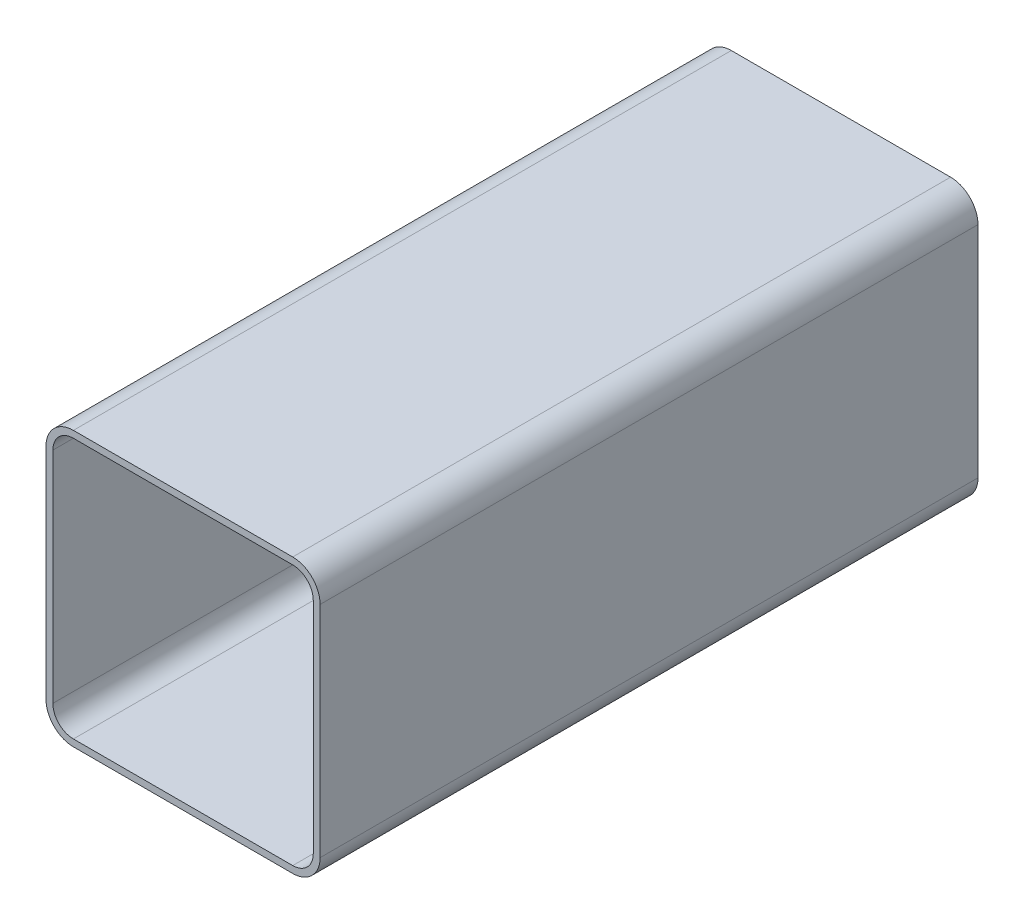
ISO-10303-21;
HEADER;
FILE_DESCRIPTION(('STEP AP214'),'2;1');
FILE_NAME('part.step','',(''),(''),'','','');
FILE_SCHEMA(('AUTOMOTIVE_DESIGN { 1 0 10303 214 1 1 1 1 }'));
ENDSEC;
DATA;
#1=APPLICATION_CONTEXT('core data for automotive mechanical design processes');
#2=APPLICATION_PROTOCOL_DEFINITION('international standard','automotive_design',2000,#1);
#3=PRODUCT_CONTEXT('',#1,'mechanical');
#4=PRODUCT('Part','Part','',(#3));
#5=PRODUCT_RELATED_PRODUCT_CATEGORY('part','',(#4));
#6=PRODUCT_DEFINITION_FORMATION('','',#4);
#7=PRODUCT_DEFINITION_CONTEXT('part definition',#1,'design');
#8=PRODUCT_DEFINITION('design','',#6,#7);
#9=PRODUCT_DEFINITION_SHAPE('','',#8);
#10=(LENGTH_UNIT() NAMED_UNIT(*) SI_UNIT(.MILLI.,.METRE.));
#11=(NAMED_UNIT(*) PLANE_ANGLE_UNIT() SI_UNIT($,.RADIAN.));
#12=(NAMED_UNIT(*) SI_UNIT($,.STERADIAN.) SOLID_ANGLE_UNIT());
#13=UNCERTAINTY_MEASURE_WITH_UNIT(LENGTH_MEASURE(1.E-05),#10,'distance_accuracy_value','');
#14=(GEOMETRIC_REPRESENTATION_CONTEXT(3) GLOBAL_UNCERTAINTY_ASSIGNED_CONTEXT((#13)) GLOBAL_UNIT_ASSIGNED_CONTEXT((#10,
#11,#12)) REPRESENTATION_CONTEXT('',''));
#15=CARTESIAN_POINT('',(0.,0.,0.));
#16=DIRECTION('',(0.,0.,1.));
#17=DIRECTION('',(1.,0.,0.));
#18=AXIS2_PLACEMENT_3D('',#15,#16,#17);
#19=CARTESIAN_POINT('',(50.8,50.8,304.8));
#20=DIRECTION('',(0.,0.,1.));
#21=DIRECTION('',(1.,0.,0.));
#22=AXIS2_PLACEMENT_3D('',#19,#20,#21);
#23=PLANE('',#22);
#24=CARTESIAN_POINT('',(50.8,50.8,304.8));
#25=DIRECTION('',(0.,0.,1.));
#26=DIRECTION('',(1.,0.,0.));
#27=AXIS2_PLACEMENT_3D('',#24,#25,#26);
#28=CIRCLE('',#27,12.7);
#29=CARTESIAN_POINT('',(63.5,50.8,304.8));
#30=VERTEX_POINT('',#29);
#31=CARTESIAN_POINT('',(50.8,63.5,304.8));
#32=VERTEX_POINT('',#31);
#33=EDGE_CURVE('E194',#30,#32,#28,.T.);
#34=ORIENTED_EDGE('',*,*,#33,.T.);
#35=DIRECTION('',(-1.,0.,0.));
#36=VECTOR('',#35,1.);
#37=CARTESIAN_POINT('',(50.8,63.5,304.8));
#38=LINE('',#37,#36);
#39=CARTESIAN_POINT('',(-50.8,63.5,304.8));
#40=VERTEX_POINT('',#39);
#41=EDGE_CURVE('E197',#32,#40,#38,.T.);
#42=ORIENTED_EDGE('',*,*,#41,.T.);
#43=CARTESIAN_POINT('',(-50.8,50.8,304.8));
#44=DIRECTION('',(0.,0.,1.));
#45=DIRECTION('',(1.,0.,0.));
#46=AXIS2_PLACEMENT_3D('',#43,#44,#45);
#47=CIRCLE('',#46,12.7);
#48=CARTESIAN_POINT('',(-63.5,50.8,304.8));
#49=VERTEX_POINT('',#48);
#50=EDGE_CURVE('E200',#40,#49,#47,.T.);
#51=ORIENTED_EDGE('',*,*,#50,.T.);
#52=DIRECTION('',(0.,-1.,0.));
#53=VECTOR('',#52,1.);
#54=CARTESIAN_POINT('',(-63.5,50.8,304.8));
#55=LINE('',#54,#53);
#56=CARTESIAN_POINT('',(-63.5,-50.8,304.8));
#57=VERTEX_POINT('',#56);
#58=EDGE_CURVE('E202',#49,#57,#55,.T.);
#59=ORIENTED_EDGE('',*,*,#58,.T.);
#60=CARTESIAN_POINT('',(-50.8,-50.8,304.8));
#61=DIRECTION('',(0.,0.,1.));
#62=DIRECTION('',(1.,0.,0.));
#63=AXIS2_PLACEMENT_3D('',#60,#61,#62);
#64=CIRCLE('',#63,12.7);
#65=CARTESIAN_POINT('',(-50.8,-63.5,304.8));
#66=VERTEX_POINT('',#65);
#67=EDGE_CURVE('E204',#57,#66,#64,.T.);
#68=ORIENTED_EDGE('',*,*,#67,.T.);
#69=DIRECTION('',(1.,0.,0.));
#70=VECTOR('',#69,1.);
#71=CARTESIAN_POINT('',(50.8,-63.5,304.8));
#72=LINE('',#71,#70);
#73=CARTESIAN_POINT('',(50.8,-63.5,304.8));
#74=VERTEX_POINT('',#73);
#75=EDGE_CURVE('E206',#66,#74,#72,.T.);
#76=ORIENTED_EDGE('',*,*,#75,.T.);
#77=CARTESIAN_POINT('',(50.8,-50.8,304.8));
#78=DIRECTION('',(0.,0.,1.));
#79=DIRECTION('',(1.,0.,0.));
#80=AXIS2_PLACEMENT_3D('',#77,#78,#79);
#81=CIRCLE('',#80,12.7);
#82=CARTESIAN_POINT('',(63.5,-50.8,304.8));
#83=VERTEX_POINT('',#82);
#84=EDGE_CURVE('E208',#74,#83,#81,.T.);
#85=ORIENTED_EDGE('',*,*,#84,.T.);
#86=DIRECTION('',(0.,1.,0.));
#87=VECTOR('',#86,1.);
#88=CARTESIAN_POINT('',(63.5,50.8,304.8));
#89=LINE('',#88,#87);
#90=EDGE_CURVE('E210',#83,#30,#89,.T.);
#91=ORIENTED_EDGE('',*,*,#90,.T.);
#92=EDGE_LOOP('',(#34,#42,#51,#59,#68,#76,#85,#91));
#93=FACE_BOUND('',#92,.T.);
#94=DIRECTION('',(0.,-1.,0.));
#95=VECTOR('',#94,1.);
#96=CARTESIAN_POINT('',(-60.325,50.8,304.8));
#97=LINE('',#96,#95);
#98=CARTESIAN_POINT('',(-60.325,50.8,304.8));
#99=VERTEX_POINT('',#98);
#100=CARTESIAN_POINT('',(-60.325,-50.8,304.8));
#101=VERTEX_POINT('',#100);
#102=EDGE_CURVE('E137',#99,#101,#97,.T.);
#103=ORIENTED_EDGE('',*,*,#102,.F.);
#104=CARTESIAN_POINT('',(-50.8,50.8,304.8));
#105=DIRECTION('',(0.,0.,1.));
#106=DIRECTION('',(1.,0.,0.));
#107=AXIS2_PLACEMENT_3D('',#104,#105,#106);
#108=CIRCLE('',#107,9.525);
#109=CARTESIAN_POINT('',(-50.8,60.325,304.8));
#110=VERTEX_POINT('',#109);
#111=EDGE_CURVE('E129',#110,#99,#108,.T.);
#112=ORIENTED_EDGE('',*,*,#111,.F.);
#113=DIRECTION('',(-1.,0.,0.));
#114=VECTOR('',#113,1.);
#115=CARTESIAN_POINT('',(50.8,60.325,304.8));
#116=LINE('',#115,#114);
#117=CARTESIAN_POINT('',(50.8,60.325,304.8));
#118=VERTEX_POINT('',#117);
#119=EDGE_CURVE('E162',#118,#110,#116,.T.);
#120=ORIENTED_EDGE('',*,*,#119,.F.);
#121=CARTESIAN_POINT('',(50.8,50.8,304.8));
#122=DIRECTION('',(0.,0.,1.));
#123=DIRECTION('',(1.,0.,0.));
#124=AXIS2_PLACEMENT_3D('',#121,#122,#123);
#125=CIRCLE('',#124,9.525);
#126=CARTESIAN_POINT('',(60.325,50.8,304.8));
#127=VERTEX_POINT('',#126);
#128=EDGE_CURVE('E160',#127,#118,#125,.T.);
#129=ORIENTED_EDGE('',*,*,#128,.F.);
#130=DIRECTION('',(0.,1.,0.));
#131=VECTOR('',#130,1.);
#132=CARTESIAN_POINT('',(60.325,50.8,304.8));
#133=LINE('',#132,#131);
#134=CARTESIAN_POINT('',(60.325,-50.8,304.8));
#135=VERTEX_POINT('',#134);
#136=EDGE_CURVE('E158',#135,#127,#133,.T.);
#137=ORIENTED_EDGE('',*,*,#136,.F.);
#138=CARTESIAN_POINT('',(50.8,-50.8,304.8));
#139=DIRECTION('',(0.,0.,1.));
#140=DIRECTION('',(1.,0.,0.));
#141=AXIS2_PLACEMENT_3D('',#138,#139,#140);
#142=CIRCLE('',#141,9.525);
#143=CARTESIAN_POINT('',(50.8,-60.325,304.8));
#144=VERTEX_POINT('',#143);
#145=EDGE_CURVE('E156',#144,#135,#142,.T.);
#146=ORIENTED_EDGE('',*,*,#145,.F.);
#147=DIRECTION('',(1.,0.,0.));
#148=VECTOR('',#147,1.);
#149=CARTESIAN_POINT('',(50.8,-60.325,304.8));
#150=LINE('',#149,#148);
#151=CARTESIAN_POINT('',(-50.8,-60.325,304.8));
#152=VERTEX_POINT('',#151);
#153=EDGE_CURVE('E152',#152,#144,#150,.T.);
#154=ORIENTED_EDGE('',*,*,#153,.F.);
#155=CARTESIAN_POINT('',(-50.8,-50.8,304.8));
#156=DIRECTION('',(0.,0.,1.));
#157=DIRECTION('',(1.,0.,0.));
#158=AXIS2_PLACEMENT_3D('',#155,#156,#157);
#159=CIRCLE('',#158,9.525);
#160=EDGE_CURVE('E150',#101,#152,#159,.T.);
#161=ORIENTED_EDGE('',*,*,#160,.F.);
#162=EDGE_LOOP('',(#103,#112,#120,#129,#137,#146,#154,#161));
#163=FACE_BOUND('',#162,.T.);
#164=ADVANCED_FACE('F16',(#93,#163),#23,.T.);
#165=CARTESIAN_POINT('',(50.8,50.8,0.));
#166=DIRECTION('',(0.,0.,1.));
#167=DIRECTION('',(1.,0.,0.));
#168=AXIS2_PLACEMENT_3D('',#165,#166,#167);
#169=PLANE('',#168);
#170=CARTESIAN_POINT('',(50.8,50.8,0.));
#171=DIRECTION('',(0.,0.,1.));
#172=DIRECTION('',(1.,0.,0.));
#173=AXIS2_PLACEMENT_3D('',#170,#171,#172);
#174=CIRCLE('',#173,12.7);
#175=CARTESIAN_POINT('',(63.5,50.8,0.));
#176=VERTEX_POINT('',#175);
#177=CARTESIAN_POINT('',(50.8,63.5,0.));
#178=VERTEX_POINT('',#177);
#179=EDGE_CURVE('E145',#176,#178,#174,.T.);
#180=ORIENTED_EDGE('',*,*,#179,.F.);
#181=DIRECTION('',(0.,1.,0.));
#182=VECTOR('',#181,1.);
#183=CARTESIAN_POINT('',(63.5,50.8,0.));
#184=LINE('',#183,#182);
#185=CARTESIAN_POINT('',(63.5,-50.8,0.));
#186=VERTEX_POINT('',#185);
#187=EDGE_CURVE('E198',#186,#176,#184,.T.);
#188=ORIENTED_EDGE('',*,*,#187,.F.);
#189=CARTESIAN_POINT('',(50.8,-50.8,0.));
#190=DIRECTION('',(0.,0.,1.));
#191=DIRECTION('',(1.,0.,0.));
#192=AXIS2_PLACEMENT_3D('',#189,#190,#191);
#193=CIRCLE('',#192,12.7);
#194=CARTESIAN_POINT('',(50.8,-63.5,0.));
#195=VERTEX_POINT('',#194);
#196=EDGE_CURVE('E225',#195,#186,#193,.T.);
#197=ORIENTED_EDGE('',*,*,#196,.F.);
#198=DIRECTION('',(1.,0.,0.));
#199=VECTOR('',#198,1.);
#200=CARTESIAN_POINT('',(50.8,-63.5,0.));
#201=LINE('',#200,#199);
#202=CARTESIAN_POINT('',(-50.8,-63.5,0.));
#203=VERTEX_POINT('',#202);
#204=EDGE_CURVE('E223',#203,#195,#201,.T.);
#205=ORIENTED_EDGE('',*,*,#204,.F.);
#206=CARTESIAN_POINT('',(-50.8,-50.8,0.));
#207=DIRECTION('',(0.,0.,1.));
#208=DIRECTION('',(1.,0.,0.));
#209=AXIS2_PLACEMENT_3D('',#206,#207,#208);
#210=CIRCLE('',#209,12.7);
#211=CARTESIAN_POINT('',(-63.5,-50.8,0.));
#212=VERTEX_POINT('',#211);
#213=EDGE_CURVE('E221',#212,#203,#210,.T.);
#214=ORIENTED_EDGE('',*,*,#213,.F.);
#215=DIRECTION('',(0.,-1.,0.));
#216=VECTOR('',#215,1.);
#217=CARTESIAN_POINT('',(-63.5,50.8,0.));
#218=LINE('',#217,#216);
#219=CARTESIAN_POINT('',(-63.5,50.8,0.));
#220=VERTEX_POINT('',#219);
#221=EDGE_CURVE('E219',#220,#212,#218,.T.);
#222=ORIENTED_EDGE('',*,*,#221,.F.);
#223=CARTESIAN_POINT('',(-50.8,50.8,0.));
#224=DIRECTION('',(0.,0.,1.));
#225=DIRECTION('',(1.,0.,0.));
#226=AXIS2_PLACEMENT_3D('',#223,#224,#225);
#227=CIRCLE('',#226,12.7);
#228=CARTESIAN_POINT('',(-50.8,63.5,0.));
#229=VERTEX_POINT('',#228);
#230=EDGE_CURVE('E217',#229,#220,#227,.T.);
#231=ORIENTED_EDGE('',*,*,#230,.F.);
#232=DIRECTION('',(-1.,0.,0.));
#233=VECTOR('',#232,1.);
#234=CARTESIAN_POINT('',(50.8,63.5,0.));
#235=LINE('',#234,#233);
#236=EDGE_CURVE('E215',#178,#229,#235,.T.);
#237=ORIENTED_EDGE('',*,*,#236,.F.);
#238=EDGE_LOOP('',(#180,#188,#197,#205,#214,#222,#231,#237));
#239=FACE_BOUND('',#238,.T.);
#240=CARTESIAN_POINT('',(-50.8,50.8,0.));
#241=DIRECTION('',(0.,0.,1.));
#242=DIRECTION('',(1.,0.,0.));
#243=AXIS2_PLACEMENT_3D('',#240,#241,#242);
#244=CIRCLE('',#243,9.525);
#245=CARTESIAN_POINT('',(-50.8,60.325,0.));
#246=VERTEX_POINT('',#245);
#247=CARTESIAN_POINT('',(-60.325,50.8,0.));
#248=VERTEX_POINT('',#247);
#249=EDGE_CURVE('E39',#246,#248,#244,.T.);
#250=ORIENTED_EDGE('',*,*,#249,.T.);
#251=DIRECTION('',(0.,-1.,0.));
#252=VECTOR('',#251,1.);
#253=CARTESIAN_POINT('',(-60.325,50.8,0.));
#254=LINE('',#253,#252);
#255=CARTESIAN_POINT('',(-60.325,-50.8,0.));
#256=VERTEX_POINT('',#255);
#257=EDGE_CURVE('E144',#248,#256,#254,.T.);
#258=ORIENTED_EDGE('',*,*,#257,.T.);
#259=CARTESIAN_POINT('',(-50.8,-50.8,0.));
#260=DIRECTION('',(0.,0.,1.));
#261=DIRECTION('',(1.,0.,0.));
#262=AXIS2_PLACEMENT_3D('',#259,#260,#261);
#263=CIRCLE('',#262,9.525);
#264=CARTESIAN_POINT('',(-50.8,-60.325,0.));
#265=VERTEX_POINT('',#264);
#266=EDGE_CURVE('E166',#256,#265,#263,.T.);
#267=ORIENTED_EDGE('',*,*,#266,.T.);
#268=DIRECTION('',(1.,0.,0.));
#269=VECTOR('',#268,1.);
#270=CARTESIAN_POINT('',(50.8,-60.325,0.));
#271=LINE('',#270,#269);
#272=CARTESIAN_POINT('',(50.8,-60.325,0.));
#273=VERTEX_POINT('',#272);
#274=EDGE_CURVE('E169',#265,#273,#271,.T.);
#275=ORIENTED_EDGE('',*,*,#274,.T.);
#276=CARTESIAN_POINT('',(50.8,-50.8,0.));
#277=DIRECTION('',(0.,0.,1.));
#278=DIRECTION('',(1.,0.,0.));
#279=AXIS2_PLACEMENT_3D('',#276,#277,#278);
#280=CIRCLE('',#279,9.525);
#281=CARTESIAN_POINT('',(60.325,-50.8,0.));
#282=VERTEX_POINT('',#281);
#283=EDGE_CURVE('E172',#273,#282,#280,.T.);
#284=ORIENTED_EDGE('',*,*,#283,.T.);
#285=DIRECTION('',(0.,1.,0.));
#286=VECTOR('',#285,1.);
#287=CARTESIAN_POINT('',(60.325,50.8,0.));
#288=LINE('',#287,#286);
#289=CARTESIAN_POINT('',(60.325,50.8,0.));
#290=VERTEX_POINT('',#289);
#291=EDGE_CURVE('E175',#282,#290,#288,.T.);
#292=ORIENTED_EDGE('',*,*,#291,.T.);
#293=CARTESIAN_POINT('',(50.8,50.8,0.));
#294=DIRECTION('',(0.,0.,1.));
#295=DIRECTION('',(1.,0.,0.));
#296=AXIS2_PLACEMENT_3D('',#293,#294,#295);
#297=CIRCLE('',#296,9.525);
#298=CARTESIAN_POINT('',(50.8,60.325,0.));
#299=VERTEX_POINT('',#298);
#300=EDGE_CURVE('E178',#290,#299,#297,.T.);
#301=ORIENTED_EDGE('',*,*,#300,.T.);
#302=DIRECTION('',(-1.,0.,0.));
#303=VECTOR('',#302,1.);
#304=CARTESIAN_POINT('',(50.8,60.325,0.));
#305=LINE('',#304,#303);
#306=EDGE_CURVE('E138',#299,#246,#305,.T.);
#307=ORIENTED_EDGE('',*,*,#306,.T.);
#308=EDGE_LOOP('',(#250,#258,#267,#275,#284,#292,#301,#307));
#309=FACE_BOUND('',#308,.T.);
#310=ADVANCED_FACE('F255',(#239,#309),#169,.F.);
#311=CARTESIAN_POINT('',(50.8,50.8,304.8));
#312=DIRECTION('',(0.,0.,-1.));
#313=DIRECTION('',(-1.,0.,0.));
#314=AXIS2_PLACEMENT_3D('',#311,#312,#313);
#315=CYLINDRICAL_SURFACE('',#314,12.7);
#316=ORIENTED_EDGE('',*,*,#179,.T.);
#317=DIRECTION('',(0.,0.,-1.));
#318=VECTOR('',#317,1.);
#319=CARTESIAN_POINT('',(50.8,63.5,304.8));
#320=LINE('',#319,#318);
#321=EDGE_CURVE('E11',#32,#178,#320,.T.);
#322=ORIENTED_EDGE('',*,*,#321,.F.);
#323=ORIENTED_EDGE('',*,*,#33,.F.);
#324=DIRECTION('',(0.,0.,-1.));
#325=VECTOR('',#324,1.);
#326=CARTESIAN_POINT('',(63.5,50.8,304.8));
#327=LINE('',#326,#325);
#328=EDGE_CURVE('E212',#30,#176,#327,.T.);
#329=ORIENTED_EDGE('',*,*,#328,.T.);
#330=EDGE_LOOP('',(#316,#322,#323,#329));
#331=FACE_BOUND('',#330,.T.);
#332=ADVANCED_FACE('F18',(#331),#315,.T.);
#333=CARTESIAN_POINT('',(50.8,63.5,304.8));
#334=DIRECTION('',(0.,-1.,0.));
#335=DIRECTION('',(1.,0.,0.));
#336=AXIS2_PLACEMENT_3D('',#333,#334,#335);
#337=PLANE('',#336);
#338=ORIENTED_EDGE('',*,*,#236,.T.);
#339=DIRECTION('',(0.,0.,-1.));
#340=VECTOR('',#339,1.);
#341=CARTESIAN_POINT('',(-50.8,63.5,304.8));
#342=LINE('',#341,#340);
#343=EDGE_CURVE('E24',#40,#229,#342,.T.);
#344=ORIENTED_EDGE('',*,*,#343,.F.);
#345=ORIENTED_EDGE('',*,*,#41,.F.);
#346=ORIENTED_EDGE('',*,*,#321,.T.);
#347=EDGE_LOOP('',(#338,#344,#345,#346));
#348=FACE_BOUND('',#347,.T.);
#349=ADVANCED_FACE('F272',(#348),#337,.F.);
#350=CARTESIAN_POINT('',(-50.8,50.8,304.8));
#351=DIRECTION('',(0.,0.,-1.));
#352=DIRECTION('',(-1.,0.,0.));
#353=AXIS2_PLACEMENT_3D('',#350,#351,#352);
#354=CYLINDRICAL_SURFACE('',#353,12.7);
#355=ORIENTED_EDGE('',*,*,#230,.T.);
#356=DIRECTION('',(0.,0.,-1.));
#357=VECTOR('',#356,1.);
#358=CARTESIAN_POINT('',(-63.5,50.8,304.8));
#359=LINE('',#358,#357);
#360=EDGE_CURVE('E242',#49,#220,#359,.T.);
#361=ORIENTED_EDGE('',*,*,#360,.F.);
#362=ORIENTED_EDGE('',*,*,#50,.F.);
#363=ORIENTED_EDGE('',*,*,#343,.T.);
#364=EDGE_LOOP('',(#355,#361,#362,#363));
#365=FACE_BOUND('',#364,.T.);
#366=ADVANCED_FACE('F249',(#365),#354,.T.);
#367=CARTESIAN_POINT('',(-63.5,50.8,304.8));
#368=DIRECTION('',(1.,0.,0.));
#369=DIRECTION('',(0.,1.,0.));
#370=AXIS2_PLACEMENT_3D('',#367,#368,#369);
#371=PLANE('',#370);
#372=ORIENTED_EDGE('',*,*,#221,.T.);
#373=DIRECTION('',(0.,0.,-1.));
#374=VECTOR('',#373,1.);
#375=CARTESIAN_POINT('',(-63.5,-50.8,304.8));
#376=LINE('',#375,#374);
#377=EDGE_CURVE('E239',#57,#212,#376,.T.);
#378=ORIENTED_EDGE('',*,*,#377,.F.);
#379=ORIENTED_EDGE('',*,*,#58,.F.);
#380=ORIENTED_EDGE('',*,*,#360,.T.);
#381=EDGE_LOOP('',(#372,#378,#379,#380));
#382=FACE_BOUND('',#381,.T.);
#383=ADVANCED_FACE('F261',(#382),#371,.F.);
#384=CARTESIAN_POINT('',(-50.8,-50.8,304.8));
#385=DIRECTION('',(0.,0.,-1.));
#386=DIRECTION('',(-1.,0.,0.));
#387=AXIS2_PLACEMENT_3D('',#384,#385,#386);
#388=CYLINDRICAL_SURFACE('',#387,12.7);
#389=ORIENTED_EDGE('',*,*,#213,.T.);
#390=DIRECTION('',(0.,0.,-1.));
#391=VECTOR('',#390,1.);
#392=CARTESIAN_POINT('',(-50.8,-63.5,304.8));
#393=LINE('',#392,#391);
#394=EDGE_CURVE('E236',#66,#203,#393,.T.);
#395=ORIENTED_EDGE('',*,*,#394,.F.);
#396=ORIENTED_EDGE('',*,*,#67,.F.);
#397=ORIENTED_EDGE('',*,*,#377,.T.);
#398=EDGE_LOOP('',(#389,#395,#396,#397));
#399=FACE_BOUND('',#398,.T.);
#400=ADVANCED_FACE('F265',(#399),#388,.T.);
#401=CARTESIAN_POINT('',(50.8,-63.5,304.8));
#402=DIRECTION('',(0.,1.,0.));
#403=DIRECTION('',(-1.,0.,0.));
#404=AXIS2_PLACEMENT_3D('',#401,#402,#403);
#405=PLANE('',#404);
#406=ORIENTED_EDGE('',*,*,#204,.T.);
#407=DIRECTION('',(0.,0.,-1.));
#408=VECTOR('',#407,1.);
#409=CARTESIAN_POINT('',(50.8,-63.5,304.8));
#410=LINE('',#409,#408);
#411=EDGE_CURVE('E233',#74,#195,#410,.T.);
#412=ORIENTED_EDGE('',*,*,#411,.F.);
#413=ORIENTED_EDGE('',*,*,#75,.F.);
#414=ORIENTED_EDGE('',*,*,#394,.T.);
#415=EDGE_LOOP('',(#406,#412,#413,#414));
#416=FACE_BOUND('',#415,.T.);
#417=ADVANCED_FACE('F285',(#416),#405,.F.);
#418=CARTESIAN_POINT('',(50.8,-50.8,304.8));
#419=DIRECTION('',(0.,0.,-1.));
#420=DIRECTION('',(-1.,0.,0.));
#421=AXIS2_PLACEMENT_3D('',#418,#419,#420);
#422=CYLINDRICAL_SURFACE('',#421,12.7);
#423=ORIENTED_EDGE('',*,*,#196,.T.);
#424=DIRECTION('',(0.,0.,-1.));
#425=VECTOR('',#424,1.);
#426=CARTESIAN_POINT('',(63.5,-50.8,304.8));
#427=LINE('',#426,#425);
#428=EDGE_CURVE('E230',#83,#186,#427,.T.);
#429=ORIENTED_EDGE('',*,*,#428,.F.);
#430=ORIENTED_EDGE('',*,*,#84,.F.);
#431=ORIENTED_EDGE('',*,*,#411,.T.);
#432=EDGE_LOOP('',(#423,#429,#430,#431));
#433=FACE_BOUND('',#432,.T.);
#434=ADVANCED_FACE('F283',(#433),#422,.T.);
#435=CARTESIAN_POINT('',(63.5,50.8,304.8));
#436=DIRECTION('',(-1.,0.,0.));
#437=DIRECTION('',(0.,-1.,0.));
#438=AXIS2_PLACEMENT_3D('',#435,#436,#437);
#439=PLANE('',#438);
#440=ORIENTED_EDGE('',*,*,#187,.T.);
#441=ORIENTED_EDGE('',*,*,#328,.F.);
#442=ORIENTED_EDGE('',*,*,#90,.F.);
#443=ORIENTED_EDGE('',*,*,#428,.T.);
#444=EDGE_LOOP('',(#440,#441,#442,#443));
#445=FACE_BOUND('',#444,.T.);
#446=ADVANCED_FACE('F278',(#445),#439,.F.);
#447=CARTESIAN_POINT('',(-50.8,50.8,304.8));
#448=DIRECTION('',(0.,0.,-1.));
#449=DIRECTION('',(-1.,0.,0.));
#450=AXIS2_PLACEMENT_3D('',#447,#448,#449);
#451=CYLINDRICAL_SURFACE('',#450,9.525);
#452=ORIENTED_EDGE('',*,*,#249,.F.);
#453=DIRECTION('',(0.,0.,-1.));
#454=VECTOR('',#453,1.);
#455=CARTESIAN_POINT('',(-50.8,60.325,304.8));
#456=LINE('',#455,#454);
#457=EDGE_CURVE('E133',#110,#246,#456,.T.);
#458=ORIENTED_EDGE('',*,*,#457,.F.);
#459=ORIENTED_EDGE('',*,*,#111,.T.);
#460=DIRECTION('',(0.,0.,-1.));
#461=VECTOR('',#460,1.);
#462=CARTESIAN_POINT('',(-60.325,50.8,304.8));
#463=LINE('',#462,#461);
#464=EDGE_CURVE('E132',#99,#248,#463,.T.);
#465=ORIENTED_EDGE('',*,*,#464,.T.);
#466=EDGE_LOOP('',(#452,#458,#459,#465));
#467=FACE_BOUND('',#466,.T.);
#468=ADVANCED_FACE('F131',(#467),#451,.F.);
#469=CARTESIAN_POINT('',(-60.325,50.8,304.8));
#470=DIRECTION('',(1.,0.,0.));
#471=DIRECTION('',(0.,0.,-1.));
#472=AXIS2_PLACEMENT_3D('',#469,#470,#471);
#473=PLANE('',#472);
#474=ORIENTED_EDGE('',*,*,#257,.F.);
#475=ORIENTED_EDGE('',*,*,#464,.F.);
#476=ORIENTED_EDGE('',*,*,#102,.T.);
#477=DIRECTION('',(0.,0.,-1.));
#478=VECTOR('',#477,1.);
#479=CARTESIAN_POINT('',(-60.325,-50.8,304.8));
#480=LINE('',#479,#478);
#481=EDGE_CURVE('E146',#101,#256,#480,.T.);
#482=ORIENTED_EDGE('',*,*,#481,.T.);
#483=EDGE_LOOP('',(#474,#475,#476,#482));
#484=FACE_BOUND('',#483,.T.);
#485=ADVANCED_FACE('F141',(#484),#473,.T.);
#486=CARTESIAN_POINT('',(-50.8,-50.8,304.8));
#487=DIRECTION('',(0.,0.,-1.));
#488=DIRECTION('',(-1.,0.,0.));
#489=AXIS2_PLACEMENT_3D('',#486,#487,#488);
#490=CYLINDRICAL_SURFACE('',#489,9.525);
#491=ORIENTED_EDGE('',*,*,#266,.F.);
#492=ORIENTED_EDGE('',*,*,#481,.F.);
#493=ORIENTED_EDGE('',*,*,#160,.T.);
#494=DIRECTION('',(0.,0.,-1.));
#495=VECTOR('',#494,1.);
#496=CARTESIAN_POINT('',(-50.8,-60.325,304.8));
#497=LINE('',#496,#495);
#498=EDGE_CURVE('E191',#152,#265,#497,.T.);
#499=ORIENTED_EDGE('',*,*,#498,.T.);
#500=EDGE_LOOP('',(#491,#492,#493,#499));
#501=FACE_BOUND('',#500,.T.);
#502=ADVANCED_FACE('F315',(#501),#490,.F.);
#503=CARTESIAN_POINT('',(50.8,-60.325,304.8));
#504=DIRECTION('',(0.,1.,0.));
#505=DIRECTION('',(-1.,0.,0.));
#506=AXIS2_PLACEMENT_3D('',#503,#504,#505);
#507=PLANE('',#506);
#508=ORIENTED_EDGE('',*,*,#274,.F.);
#509=ORIENTED_EDGE('',*,*,#498,.F.);
#510=ORIENTED_EDGE('',*,*,#153,.T.);
#511=DIRECTION('',(0.,0.,-1.));
#512=VECTOR('',#511,1.);
#513=CARTESIAN_POINT('',(50.8,-60.325,304.8));
#514=LINE('',#513,#512);
#515=EDGE_CURVE('E189',#144,#273,#514,.T.);
#516=ORIENTED_EDGE('',*,*,#515,.T.);
#517=EDGE_LOOP('',(#508,#509,#510,#516));
#518=FACE_BOUND('',#517,.T.);
#519=ADVANCED_FACE('F320',(#518),#507,.T.);
#520=CARTESIAN_POINT('',(50.8,-50.8,304.8));
#521=DIRECTION('',(0.,0.,-1.));
#522=DIRECTION('',(-1.,0.,0.));
#523=AXIS2_PLACEMENT_3D('',#520,#521,#522);
#524=CYLINDRICAL_SURFACE('',#523,9.525);
#525=ORIENTED_EDGE('',*,*,#283,.F.);
#526=ORIENTED_EDGE('',*,*,#515,.F.);
#527=ORIENTED_EDGE('',*,*,#145,.T.);
#528=DIRECTION('',(0.,0.,-1.));
#529=VECTOR('',#528,1.);
#530=CARTESIAN_POINT('',(60.325,-50.8,304.8));
#531=LINE('',#530,#529);
#532=EDGE_CURVE('E187',#135,#282,#531,.T.);
#533=ORIENTED_EDGE('',*,*,#532,.T.);
#534=EDGE_LOOP('',(#525,#526,#527,#533));
#535=FACE_BOUND('',#534,.T.);
#536=ADVANCED_FACE('F326',(#535),#524,.F.);
#537=CARTESIAN_POINT('',(60.325,50.8,304.8));
#538=DIRECTION('',(-1.,0.,0.));
#539=DIRECTION('',(0.,-1.,0.));
#540=AXIS2_PLACEMENT_3D('',#537,#538,#539);
#541=PLANE('',#540);
#542=ORIENTED_EDGE('',*,*,#291,.F.);
#543=ORIENTED_EDGE('',*,*,#532,.F.);
#544=ORIENTED_EDGE('',*,*,#136,.T.);
#545=DIRECTION('',(0.,0.,-1.));
#546=VECTOR('',#545,1.);
#547=CARTESIAN_POINT('',(60.325,50.8,304.8));
#548=LINE('',#547,#546);
#549=EDGE_CURVE('E185',#127,#290,#548,.T.);
#550=ORIENTED_EDGE('',*,*,#549,.T.);
#551=EDGE_LOOP('',(#542,#543,#544,#550));
#552=FACE_BOUND('',#551,.T.);
#553=ADVANCED_FACE('F330',(#552),#541,.T.);
#554=CARTESIAN_POINT('',(50.8,50.8,304.8));
#555=DIRECTION('',(0.,0.,-1.));
#556=DIRECTION('',(-1.,0.,0.));
#557=AXIS2_PLACEMENT_3D('',#554,#555,#556);
#558=CYLINDRICAL_SURFACE('',#557,9.525);
#559=ORIENTED_EDGE('',*,*,#300,.F.);
#560=ORIENTED_EDGE('',*,*,#549,.F.);
#561=ORIENTED_EDGE('',*,*,#128,.T.);
#562=DIRECTION('',(0.,0.,-1.));
#563=VECTOR('',#562,1.);
#564=CARTESIAN_POINT('',(50.8,60.325,304.8));
#565=LINE('',#564,#563);
#566=EDGE_CURVE('E31',#118,#299,#565,.T.);
#567=ORIENTED_EDGE('',*,*,#566,.T.);
#568=EDGE_LOOP('',(#559,#560,#561,#567));
#569=FACE_BOUND('',#568,.T.);
#570=ADVANCED_FACE('F334',(#569),#558,.F.);
#571=CARTESIAN_POINT('',(50.8,60.325,304.8));
#572=DIRECTION('',(0.,-1.,0.));
#573=DIRECTION('',(1.,0.,0.));
#574=AXIS2_PLACEMENT_3D('',#571,#572,#573);
#575=PLANE('',#574);
#576=ORIENTED_EDGE('',*,*,#306,.F.);
#577=ORIENTED_EDGE('',*,*,#566,.F.);
#578=ORIENTED_EDGE('',*,*,#119,.T.);
#579=ORIENTED_EDGE('',*,*,#457,.T.);
#580=EDGE_LOOP('',(#576,#577,#578,#579));
#581=FACE_BOUND('',#580,.T.);
#582=ADVANCED_FACE('F338',(#581),#575,.T.);
#583=CLOSED_SHELL('',(#164,#310,#332,#349,#366,#383,#400,#417,#434,#446,#468,#485,#502,#519,
#536,#553,#570,#582));
#584=MANIFOLD_SOLID_BREP('B1',#583);
#585=ADVANCED_BREP_SHAPE_REPRESENTATION('',(#18,#584),#14);
#586=SHAPE_DEFINITION_REPRESENTATION(#9,#585);
ENDSEC;
END-ISO-10303-21;
